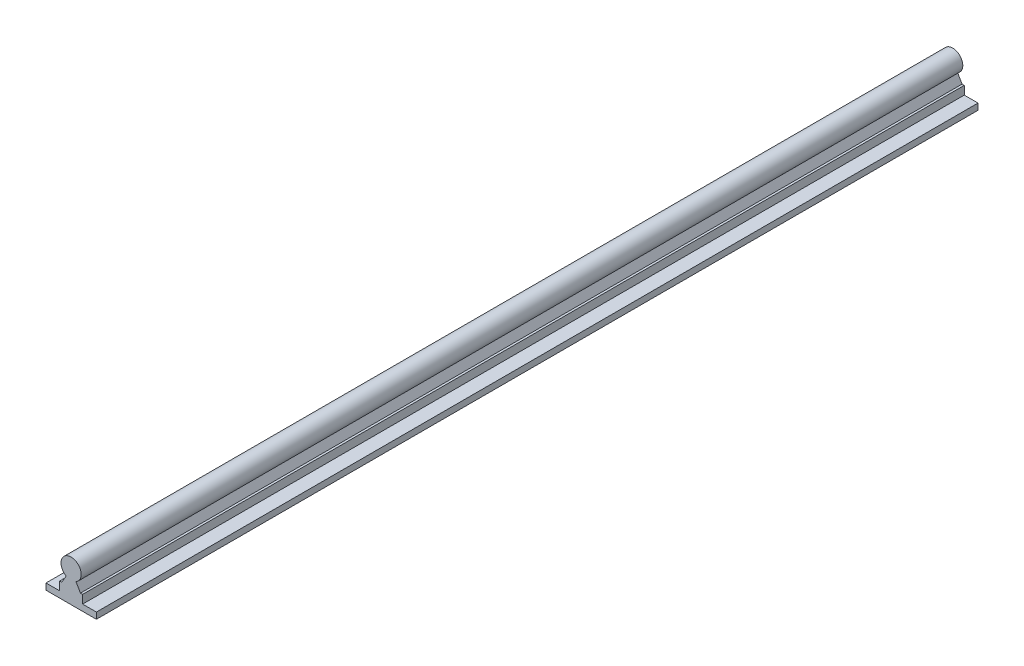
ISO-10303-21;
HEADER;
FILE_DESCRIPTION(('STEP AP214'),'2;1');
FILE_NAME('part.step','',(''),(''),'','','');
FILE_SCHEMA(('AUTOMOTIVE_DESIGN { 1 0 10303 214 1 1 1 1 }'));
ENDSEC;
DATA;
#1=APPLICATION_CONTEXT('core data for automotive mechanical design processes');
#2=APPLICATION_PROTOCOL_DEFINITION('international standard','automotive_design',2000,#1);
#3=PRODUCT_CONTEXT('',#1,'mechanical');
#4=PRODUCT('Part','Part','',(#3));
#5=PRODUCT_RELATED_PRODUCT_CATEGORY('part','',(#4));
#6=PRODUCT_DEFINITION_FORMATION('','',#4);
#7=PRODUCT_DEFINITION_CONTEXT('part definition',#1,'design');
#8=PRODUCT_DEFINITION('design','',#6,#7);
#9=PRODUCT_DEFINITION_SHAPE('','',#8);
#10=(LENGTH_UNIT() NAMED_UNIT(*) SI_UNIT(.MILLI.,.METRE.));
#11=(NAMED_UNIT(*) PLANE_ANGLE_UNIT() SI_UNIT($,.RADIAN.));
#12=(NAMED_UNIT(*) SI_UNIT($,.STERADIAN.) SOLID_ANGLE_UNIT());
#13=UNCERTAINTY_MEASURE_WITH_UNIT(LENGTH_MEASURE(1.E-05),#10,'distance_accuracy_value','');
#14=(GEOMETRIC_REPRESENTATION_CONTEXT(3) GLOBAL_UNCERTAINTY_ASSIGNED_CONTEXT((#13)) GLOBAL_UNIT_ASSIGNED_CONTEXT((#10,
#11,#12)) REPRESENTATION_CONTEXT('',''));
#15=CARTESIAN_POINT('',(0.,0.,0.));
#16=DIRECTION('',(0.,0.,1.));
#17=DIRECTION('',(1.,0.,0.));
#18=AXIS2_PLACEMENT_3D('',#15,#16,#17);
#19=CARTESIAN_POINT('',(-25.9312656727246,-7.76101992966002,700.));
#20=DIRECTION('',(-1.,0.,0.));
#21=DIRECTION('',(0.,0.,1.));
#22=AXIS2_PLACEMENT_3D('',#19,#20,#21);
#23=PLANE('',#22);
#24=DIRECTION('',(0.,1.,0.));
#25=VECTOR('',#24,1.);
#26=CARTESIAN_POINT('',(-25.9312656727246,-7.76101992966002,0.));
#27=LINE('',#26,#25);
#28=CARTESIAN_POINT('',(-25.9312656727246,-7.76101992966002,0.));
#29=VERTEX_POINT('',#28);
#30=CARTESIAN_POINT('',(-25.9312656727246,-2.76101992966003,0.));
#31=VERTEX_POINT('',#30);
#32=EDGE_CURVE('E153',#29,#31,#27,.T.);
#33=ORIENTED_EDGE('',*,*,#32,.F.);
#34=DIRECTION('',(0.,0.,-1.));
#35=VECTOR('',#34,1.);
#36=CARTESIAN_POINT('',(-25.9312656727246,-7.76101992966002,700.));
#37=LINE('',#36,#35);
#38=CARTESIAN_POINT('',(-25.9312656727246,-7.76101992966002,700.));
#39=VERTEX_POINT('',#38);
#40=EDGE_CURVE('E11',#39,#29,#37,.T.);
#41=ORIENTED_EDGE('',*,*,#40,.F.);
#42=DIRECTION('',(0.,1.,0.));
#43=VECTOR('',#42,1.);
#44=CARTESIAN_POINT('',(-25.9312656727246,-7.76101992966002,700.));
#45=LINE('',#44,#43);
#46=CARTESIAN_POINT('',(-25.9312656727246,-2.76101992966003,700.));
#47=VERTEX_POINT('',#46);
#48=EDGE_CURVE('E185',#39,#47,#45,.T.);
#49=ORIENTED_EDGE('',*,*,#48,.T.);
#50=DIRECTION('',(0.,0.,-1.));
#51=VECTOR('',#50,1.);
#52=CARTESIAN_POINT('',(-25.9312656727246,-2.76101992966003,700.));
#53=LINE('',#52,#51);
#54=EDGE_CURVE('E35',#47,#31,#53,.T.);
#55=ORIENTED_EDGE('',*,*,#54,.T.);
#56=EDGE_LOOP('',(#33,#41,#49,#55));
#57=FACE_BOUND('',#56,.T.);
#58=ADVANCED_FACE('F32',(#57),#23,.T.);
#59=CARTESIAN_POINT('',(14.0687343272754,-7.76101992966002,700.));
#60=DIRECTION('',(0.,-1.,0.));
#61=DIRECTION('',(0.,0.,-1.));
#62=AXIS2_PLACEMENT_3D('',#59,#60,#61);
#63=PLANE('',#62);
#64=DIRECTION('',(-1.,0.,0.));
#65=VECTOR('',#64,1.);
#66=CARTESIAN_POINT('',(14.0687343272754,-7.76101992966002,0.));
#67=LINE('',#66,#65);
#68=CARTESIAN_POINT('',(14.0687343272754,-7.76101992966002,0.));
#69=VERTEX_POINT('',#68);
#70=EDGE_CURVE('E183',#69,#29,#67,.T.);
#71=ORIENTED_EDGE('',*,*,#70,.F.);
#72=DIRECTION('',(0.,0.,-1.));
#73=VECTOR('',#72,1.);
#74=CARTESIAN_POINT('',(14.0687343272754,-7.76101992966002,700.));
#75=LINE('',#74,#73);
#76=CARTESIAN_POINT('',(14.0687343272754,-7.76101992966002,700.));
#77=VERTEX_POINT('',#76);
#78=EDGE_CURVE('E41',#77,#69,#75,.T.);
#79=ORIENTED_EDGE('',*,*,#78,.F.);
#80=DIRECTION('',(-1.,0.,0.));
#81=VECTOR('',#80,1.);
#82=CARTESIAN_POINT('',(14.0687343272754,-7.76101992966002,700.));
#83=LINE('',#82,#81);
#84=EDGE_CURVE('E143',#77,#39,#83,.T.);
#85=ORIENTED_EDGE('',*,*,#84,.T.);
#86=ORIENTED_EDGE('',*,*,#40,.T.);
#87=EDGE_LOOP('',(#71,#79,#85,#86));
#88=FACE_BOUND('',#87,.T.);
#89=ADVANCED_FACE('F205',(#88),#63,.T.);
#90=CARTESIAN_POINT('',(14.0687343272754,-2.76101992966002,700.));
#91=DIRECTION('',(1.,0.,0.));
#92=DIRECTION('',(0.,0.,-1.));
#93=AXIS2_PLACEMENT_3D('',#90,#91,#92);
#94=PLANE('',#93);
#95=DIRECTION('',(0.,-1.,0.));
#96=VECTOR('',#95,1.);
#97=CARTESIAN_POINT('',(14.0687343272754,-2.76101992966002,0.));
#98=LINE('',#97,#96);
#99=CARTESIAN_POINT('',(14.0687343272754,-2.76101992966002,0.));
#100=VERTEX_POINT('',#99);
#101=EDGE_CURVE('E130',#100,#69,#98,.T.);
#102=ORIENTED_EDGE('',*,*,#101,.F.);
#103=DIRECTION('',(0.,0.,-1.));
#104=VECTOR('',#103,1.);
#105=CARTESIAN_POINT('',(14.0687343272754,-2.76101992966002,700.));
#106=LINE('',#105,#104);
#107=CARTESIAN_POINT('',(14.0687343272754,-2.76101992966002,700.));
#108=VERTEX_POINT('',#107);
#109=EDGE_CURVE('E125',#108,#100,#106,.T.);
#110=ORIENTED_EDGE('',*,*,#109,.F.);
#111=DIRECTION('',(0.,-1.,0.));
#112=VECTOR('',#111,1.);
#113=CARTESIAN_POINT('',(14.0687343272754,-2.76101992966002,700.));
#114=LINE('',#113,#112);
#115=EDGE_CURVE('E128',#108,#77,#114,.T.);
#116=ORIENTED_EDGE('',*,*,#115,.T.);
#117=ORIENTED_EDGE('',*,*,#78,.T.);
#118=EDGE_LOOP('',(#102,#110,#116,#117));
#119=FACE_BOUND('',#118,.T.);
#120=ADVANCED_FACE('F127',(#119),#94,.T.);
#121=CARTESIAN_POINT('',(3.16040300380469,-2.76101992966,700.));
#122=DIRECTION('',(0.,1.,0.));
#123=DIRECTION('',(-1.,0.,0.));
#124=AXIS2_PLACEMENT_3D('',#121,#122,#123);
#125=PLANE('',#124);
#126=DIRECTION('',(1.,0.,0.));
#127=VECTOR('',#126,1.);
#128=CARTESIAN_POINT('',(3.16040300380469,-2.76101992966,0.));
#129=LINE('',#128,#127);
#130=CARTESIAN_POINT('',(3.16040300380469,-2.76101992966,0.));
#131=VERTEX_POINT('',#130);
#132=EDGE_CURVE('E180',#131,#100,#129,.T.);
#133=ORIENTED_EDGE('',*,*,#132,.F.);
#134=DIRECTION('',(0.,0.,-1.));
#135=VECTOR('',#134,1.);
#136=CARTESIAN_POINT('',(3.16040300380469,-2.76101992966,700.));
#137=LINE('',#136,#135);
#138=CARTESIAN_POINT('',(3.16040300380469,-2.76101992966,700.));
#139=VERTEX_POINT('',#138);
#140=EDGE_CURVE('E135',#139,#131,#137,.T.);
#141=ORIENTED_EDGE('',*,*,#140,.F.);
#142=DIRECTION('',(1.,0.,0.));
#143=VECTOR('',#142,1.);
#144=CARTESIAN_POINT('',(3.16040300380469,-2.76101992966,700.));
#145=LINE('',#144,#143);
#146=EDGE_CURVE('E141',#139,#108,#145,.T.);
#147=ORIENTED_EDGE('',*,*,#146,.T.);
#148=ORIENTED_EDGE('',*,*,#109,.T.);
#149=EDGE_LOOP('',(#133,#141,#147,#148));
#150=FACE_BOUND('',#149,.T.);
#151=ADVANCED_FACE('F145',(#150),#125,.T.);
#152=CARTESIAN_POINT('',(3.16040300380469,3.93898007033999,700.));
#153=DIRECTION('',(1.,0.,0.));
#154=DIRECTION('',(0.,1.,0.));
#155=AXIS2_PLACEMENT_3D('',#152,#153,#154);
#156=PLANE('',#155);
#157=DIRECTION('',(0.,-1.,0.));
#158=VECTOR('',#157,1.);
#159=CARTESIAN_POINT('',(3.16040300380469,3.93898007033999,0.));
#160=LINE('',#159,#158);
#161=CARTESIAN_POINT('',(3.16040300380469,3.93898007033999,0.));
#162=VERTEX_POINT('',#161);
#163=EDGE_CURVE('E177',#162,#131,#160,.T.);
#164=ORIENTED_EDGE('',*,*,#163,.F.);
#165=DIRECTION('',(0.,0.,-1.));
#166=VECTOR('',#165,1.);
#167=CARTESIAN_POINT('',(3.16040300380469,3.93898007033999,700.));
#168=LINE('',#167,#166);
#169=CARTESIAN_POINT('',(3.16040300380469,3.93898007033999,700.));
#170=VERTEX_POINT('',#169);
#171=EDGE_CURVE('E189',#170,#162,#168,.T.);
#172=ORIENTED_EDGE('',*,*,#171,.F.);
#173=DIRECTION('',(0.,-1.,0.));
#174=VECTOR('',#173,1.);
#175=CARTESIAN_POINT('',(3.16040300380469,3.93898007033999,700.));
#176=LINE('',#175,#174);
#177=EDGE_CURVE('E146',#170,#139,#176,.T.);
#178=ORIENTED_EDGE('',*,*,#177,.T.);
#179=ORIENTED_EDGE('',*,*,#140,.T.);
#180=EDGE_LOOP('',(#164,#172,#178,#179));
#181=FACE_BOUND('',#180,.T.);
#182=ADVANCED_FACE('F218',(#181),#156,.T.);
#183=CARTESIAN_POINT('',(1.43223964586137,3.93898007033999,700.));
#184=DIRECTION('',(0.,1.,0.));
#185=DIRECTION('',(0.,0.,1.));
#186=AXIS2_PLACEMENT_3D('',#183,#184,#185);
#187=PLANE('',#186);
#188=DIRECTION('',(1.,0.,0.));
#189=VECTOR('',#188,1.);
#190=CARTESIAN_POINT('',(1.43223964586137,3.93898007033999,0.));
#191=LINE('',#190,#189);
#192=CARTESIAN_POINT('',(1.43223964586137,3.93898007033999,0.));
#193=VERTEX_POINT('',#192);
#194=EDGE_CURVE('E174',#193,#162,#191,.T.);
#195=ORIENTED_EDGE('',*,*,#194,.F.);
#196=DIRECTION('',(0.,0.,-1.));
#197=VECTOR('',#196,1.);
#198=CARTESIAN_POINT('',(1.43223964586137,3.93898007033999,700.));
#199=LINE('',#198,#197);
#200=CARTESIAN_POINT('',(1.43223964586137,3.93898007033999,700.));
#201=VERTEX_POINT('',#200);
#202=EDGE_CURVE('E191',#201,#193,#199,.T.);
#203=ORIENTED_EDGE('',*,*,#202,.F.);
#204=DIRECTION('',(1.,0.,0.));
#205=VECTOR('',#204,1.);
#206=CARTESIAN_POINT('',(1.43223964586137,3.93898007033999,700.));
#207=LINE('',#206,#205);
#208=EDGE_CURVE('E148',#201,#170,#207,.T.);
#209=ORIENTED_EDGE('',*,*,#208,.T.);
#210=ORIENTED_EDGE('',*,*,#171,.T.);
#211=EDGE_LOOP('',(#195,#203,#209,#210));
#212=FACE_BOUND('',#211,.T.);
#213=ADVANCED_FACE('F221',(#212),#187,.T.);
#214=CARTESIAN_POINT('',(-2.08959699619534,10.03898007034,700.));
#215=DIRECTION('',(0.866025403784439,0.5,0.));
#216=DIRECTION('',(-0.5,0.866025403784439,0.));
#217=AXIS2_PLACEMENT_3D('',#214,#215,#216);
#218=PLANE('',#217);
#219=DIRECTION('',(0.5,-0.866025403784439,0.));
#220=VECTOR('',#219,1.);
#221=CARTESIAN_POINT('',(-2.08959699619534,10.03898007034,0.));
#222=LINE('',#221,#220);
#223=CARTESIAN_POINT('',(-2.08959699619534,10.03898007034,0.));
#224=VERTEX_POINT('',#223);
#225=EDGE_CURVE('E171',#224,#193,#222,.T.);
#226=ORIENTED_EDGE('',*,*,#225,.F.);
#227=DIRECTION('',(0.,0.,-1.));
#228=VECTOR('',#227,1.);
#229=CARTESIAN_POINT('',(-2.08959699619534,10.03898007034,700.));
#230=LINE('',#229,#228);
#231=CARTESIAN_POINT('',(-2.08959699619534,10.03898007034,700.));
#232=VERTEX_POINT('',#231);
#233=EDGE_CURVE('E193',#232,#224,#230,.T.);
#234=ORIENTED_EDGE('',*,*,#233,.F.);
#235=DIRECTION('',(0.5,-0.866025403784439,0.));
#236=VECTOR('',#235,1.);
#237=CARTESIAN_POINT('',(-2.08959699619534,10.03898007034,700.));
#238=LINE('',#237,#236);
#239=EDGE_CURVE('E347',#232,#201,#238,.T.);
#240=ORIENTED_EDGE('',*,*,#239,.T.);
#241=ORIENTED_EDGE('',*,*,#202,.T.);
#242=EDGE_LOOP('',(#226,#234,#240,#241));
#243=FACE_BOUND('',#242,.T.);
#244=ADVANCED_FACE('F225',(#243),#218,.T.);
#245=CARTESIAN_POINT('',(-6.01043133445998,17.012290481607,700.));
#246=DIRECTION('',(0.,0.,-1.));
#247=DIRECTION('',(-1.,0.,0.));
#248=AXIS2_PLACEMENT_3D('',#245,#246,#247);
#249=CYLINDRICAL_SURFACE('',#248,8.);
#250=CARTESIAN_POINT('',(-6.01043133445998,17.012290481607,0.));
#251=DIRECTION('',(0.,0.,-1.));
#252=DIRECTION('',(-1.,0.,0.));
#253=AXIS2_PLACEMENT_3D('',#250,#251,#252);
#254=CIRCLE('',#253,8.);
#255=CARTESIAN_POINT('',(-9.93126567272462,10.03898007034,0.));
#256=VERTEX_POINT('',#255);
#257=EDGE_CURVE('E168',#256,#224,#254,.T.);
#258=ORIENTED_EDGE('',*,*,#257,.F.);
#259=DIRECTION('',(0.,0.,-1.));
#260=VECTOR('',#259,1.);
#261=CARTESIAN_POINT('',(-9.93126567272462,10.03898007034,700.));
#262=LINE('',#261,#260);
#263=CARTESIAN_POINT('',(-9.93126567272462,10.03898007034,700.));
#264=VERTEX_POINT('',#263);
#265=EDGE_CURVE('E195',#264,#256,#262,.T.);
#266=ORIENTED_EDGE('',*,*,#265,.F.);
#267=CARTESIAN_POINT('',(-6.01043133445998,17.012290481607,700.));
#268=DIRECTION('',(0.,0.,-1.));
#269=DIRECTION('',(-1.,0.,0.));
#270=AXIS2_PLACEMENT_3D('',#267,#268,#269);
#271=CIRCLE('',#270,8.);
#272=EDGE_CURVE('E351',#264,#232,#271,.T.);
#273=ORIENTED_EDGE('',*,*,#272,.T.);
#274=ORIENTED_EDGE('',*,*,#233,.T.);
#275=EDGE_LOOP('',(#258,#266,#273,#274));
#276=FACE_BOUND('',#275,.T.);
#277=ADVANCED_FACE('F229',(#276),#249,.T.);
#278=CARTESIAN_POINT('',(-13.4531023147813,3.93898007033998,700.));
#279=DIRECTION('',(-0.86602540378444,0.499999999999998,0.));
#280=DIRECTION('',(-0.499999999999998,-0.86602540378444,0.));
#281=AXIS2_PLACEMENT_3D('',#278,#279,#280);
#282=PLANE('',#281);
#283=DIRECTION('',(0.499999999999998,0.86602540378444,0.));
#284=VECTOR('',#283,1.);
#285=CARTESIAN_POINT('',(-13.4531023147813,3.93898007033998,0.));
#286=LINE('',#285,#284);
#287=CARTESIAN_POINT('',(-13.4531023147813,3.93898007033998,0.));
#288=VERTEX_POINT('',#287);
#289=EDGE_CURVE('E165',#288,#256,#286,.T.);
#290=ORIENTED_EDGE('',*,*,#289,.F.);
#291=DIRECTION('',(0.,0.,-1.));
#292=VECTOR('',#291,1.);
#293=CARTESIAN_POINT('',(-13.4531023147813,3.93898007033998,700.));
#294=LINE('',#293,#292);
#295=CARTESIAN_POINT('',(-13.4531023147813,3.93898007033998,700.));
#296=VERTEX_POINT('',#295);
#297=EDGE_CURVE('E197',#296,#288,#294,.T.);
#298=ORIENTED_EDGE('',*,*,#297,.F.);
#299=DIRECTION('',(0.499999999999998,0.86602540378444,0.));
#300=VECTOR('',#299,1.);
#301=CARTESIAN_POINT('',(-13.4531023147813,3.93898007033998,700.));
#302=LINE('',#301,#300);
#303=EDGE_CURVE('E340',#296,#264,#302,.T.);
#304=ORIENTED_EDGE('',*,*,#303,.T.);
#305=ORIENTED_EDGE('',*,*,#265,.T.);
#306=EDGE_LOOP('',(#290,#298,#304,#305));
#307=FACE_BOUND('',#306,.T.);
#308=ADVANCED_FACE('F233',(#307),#282,.T.);
#309=CARTESIAN_POINT('',(-15.1812656727246,3.93898007033998,700.));
#310=DIRECTION('',(0.,1.,0.));
#311=DIRECTION('',(-1.,0.,0.));
#312=AXIS2_PLACEMENT_3D('',#309,#310,#311);
#313=PLANE('',#312);
#314=DIRECTION('',(1.,0.,0.));
#315=VECTOR('',#314,1.);
#316=CARTESIAN_POINT('',(-15.1812656727246,3.93898007033998,0.));
#317=LINE('',#316,#315);
#318=CARTESIAN_POINT('',(-15.1812656727246,3.93898007033998,0.));
#319=VERTEX_POINT('',#318);
#320=EDGE_CURVE('E162',#319,#288,#317,.T.);
#321=ORIENTED_EDGE('',*,*,#320,.F.);
#322=DIRECTION('',(0.,0.,-1.));
#323=VECTOR('',#322,1.);
#324=CARTESIAN_POINT('',(-15.1812656727246,3.93898007033998,700.));
#325=LINE('',#324,#323);
#326=CARTESIAN_POINT('',(-15.1812656727246,3.93898007033998,700.));
#327=VERTEX_POINT('',#326);
#328=EDGE_CURVE('E199',#327,#319,#325,.T.);
#329=ORIENTED_EDGE('',*,*,#328,.F.);
#330=DIRECTION('',(1.,0.,0.));
#331=VECTOR('',#330,1.);
#332=CARTESIAN_POINT('',(-15.1812656727246,3.93898007033998,700.));
#333=LINE('',#332,#331);
#334=EDGE_CURVE('E336',#327,#296,#333,.T.);
#335=ORIENTED_EDGE('',*,*,#334,.T.);
#336=ORIENTED_EDGE('',*,*,#297,.T.);
#337=EDGE_LOOP('',(#321,#329,#335,#336));
#338=FACE_BOUND('',#337,.T.);
#339=ADVANCED_FACE('F237',(#338),#313,.T.);
#340=CARTESIAN_POINT('',(-15.1812656727246,-2.76101992966002,700.));
#341=DIRECTION('',(-1.,0.,0.));
#342=DIRECTION('',(0.,0.,1.));
#343=AXIS2_PLACEMENT_3D('',#340,#341,#342);
#344=PLANE('',#343);
#345=DIRECTION('',(0.,1.,0.));
#346=VECTOR('',#345,1.);
#347=CARTESIAN_POINT('',(-15.1812656727246,-2.76101992966002,0.));
#348=LINE('',#347,#346);
#349=CARTESIAN_POINT('',(-15.1812656727246,-2.76101992966002,0.));
#350=VERTEX_POINT('',#349);
#351=EDGE_CURVE('E159',#350,#319,#348,.T.);
#352=ORIENTED_EDGE('',*,*,#351,.F.);
#353=DIRECTION('',(0.,0.,-1.));
#354=VECTOR('',#353,1.);
#355=CARTESIAN_POINT('',(-15.1812656727246,-2.76101992966002,700.));
#356=LINE('',#355,#354);
#357=CARTESIAN_POINT('',(-15.1812656727246,-2.76101992966002,700.));
#358=VERTEX_POINT('',#357);
#359=EDGE_CURVE('E200',#358,#350,#356,.T.);
#360=ORIENTED_EDGE('',*,*,#359,.F.);
#361=DIRECTION('',(0.,1.,0.));
#362=VECTOR('',#361,1.);
#363=CARTESIAN_POINT('',(-15.1812656727246,-2.76101992966002,700.));
#364=LINE('',#363,#362);
#365=EDGE_CURVE('E357',#358,#327,#364,.T.);
#366=ORIENTED_EDGE('',*,*,#365,.T.);
#367=ORIENTED_EDGE('',*,*,#328,.T.);
#368=EDGE_LOOP('',(#352,#360,#366,#367));
#369=FACE_BOUND('',#368,.T.);
#370=ADVANCED_FACE('F241',(#369),#344,.T.);
#371=CARTESIAN_POINT('',(-25.9312656727246,-2.76101992966003,700.));
#372=DIRECTION('',(0.,1.,0.));
#373=DIRECTION('',(-1.,0.,0.));
#374=AXIS2_PLACEMENT_3D('',#371,#372,#373);
#375=PLANE('',#374);
#376=DIRECTION('',(1.,0.,0.));
#377=VECTOR('',#376,1.);
#378=CARTESIAN_POINT('',(-25.9312656727246,-2.76101992966003,0.));
#379=LINE('',#378,#377);
#380=EDGE_CURVE('E156',#31,#350,#379,.T.);
#381=ORIENTED_EDGE('',*,*,#380,.F.);
#382=ORIENTED_EDGE('',*,*,#54,.F.);
#383=DIRECTION('',(1.,0.,0.));
#384=VECTOR('',#383,1.);
#385=CARTESIAN_POINT('',(-25.9312656727246,-2.76101992966003,700.));
#386=LINE('',#385,#384);
#387=EDGE_CURVE('E359',#47,#358,#386,.T.);
#388=ORIENTED_EDGE('',*,*,#387,.T.);
#389=ORIENTED_EDGE('',*,*,#359,.T.);
#390=EDGE_LOOP('',(#381,#382,#388,#389));
#391=FACE_BOUND('',#390,.T.);
#392=ADVANCED_FACE('F202',(#391),#375,.T.);
#393=CARTESIAN_POINT('',(-6.01043133445998,17.012290481607,700.));
#394=DIRECTION('',(0.,0.,-1.));
#395=DIRECTION('',(-1.,0.,0.));
#396=AXIS2_PLACEMENT_3D('',#393,#394,#395);
#397=PLANE('',#396);
#398=ORIENTED_EDGE('',*,*,#48,.F.);
#399=ORIENTED_EDGE('',*,*,#84,.F.);
#400=ORIENTED_EDGE('',*,*,#115,.F.);
#401=ORIENTED_EDGE('',*,*,#146,.F.);
#402=ORIENTED_EDGE('',*,*,#177,.F.);
#403=ORIENTED_EDGE('',*,*,#208,.F.);
#404=ORIENTED_EDGE('',*,*,#239,.F.);
#405=ORIENTED_EDGE('',*,*,#272,.F.);
#406=ORIENTED_EDGE('',*,*,#303,.F.);
#407=ORIENTED_EDGE('',*,*,#334,.F.);
#408=ORIENTED_EDGE('',*,*,#365,.F.);
#409=ORIENTED_EDGE('',*,*,#387,.F.);
#410=EDGE_LOOP('',(#398,#399,#400,#401,#402,#403,#404,#405,#406,#407,#408,#409));
#411=FACE_BOUND('',#410,.T.);
#412=ADVANCED_FACE('F139',(#411),#397,.F.);
#413=CARTESIAN_POINT('',(-6.01043133445998,17.012290481607,0.));
#414=DIRECTION('',(0.,0.,-1.));
#415=DIRECTION('',(-1.,0.,0.));
#416=AXIS2_PLACEMENT_3D('',#413,#414,#415);
#417=PLANE('',#416);
#418=ORIENTED_EDGE('',*,*,#32,.T.);
#419=ORIENTED_EDGE('',*,*,#380,.T.);
#420=ORIENTED_EDGE('',*,*,#351,.T.);
#421=ORIENTED_EDGE('',*,*,#320,.T.);
#422=ORIENTED_EDGE('',*,*,#289,.T.);
#423=ORIENTED_EDGE('',*,*,#257,.T.);
#424=ORIENTED_EDGE('',*,*,#225,.T.);
#425=ORIENTED_EDGE('',*,*,#194,.T.);
#426=ORIENTED_EDGE('',*,*,#163,.T.);
#427=ORIENTED_EDGE('',*,*,#132,.T.);
#428=ORIENTED_EDGE('',*,*,#101,.T.);
#429=ORIENTED_EDGE('',*,*,#70,.T.);
#430=EDGE_LOOP('',(#418,#419,#420,#421,#422,#423,#424,#425,#426,#427,#428,#429));
#431=FACE_BOUND('',#430,.T.);
#432=ADVANCED_FACE('F204',(#431),#417,.T.);
#433=CLOSED_SHELL('',(#58,#89,#120,#151,#182,#213,#244,#277,#308,#339,#370,#392,#412,#432));
#434=MANIFOLD_SOLID_BREP('B2',#433);
#435=ADVANCED_BREP_SHAPE_REPRESENTATION('',(#18,#434),#14);
#436=SHAPE_DEFINITION_REPRESENTATION(#9,#435);
ENDSEC;
END-ISO-10303-21;
